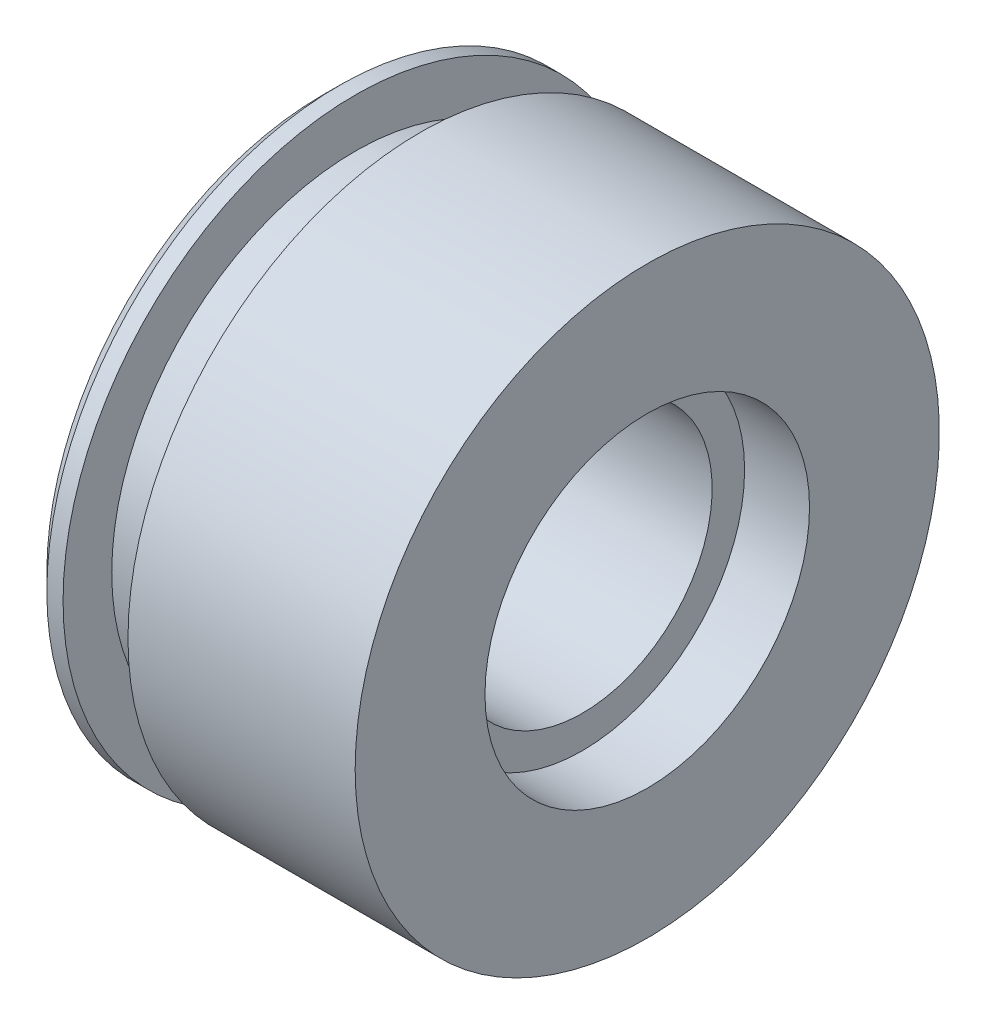
ISO-10303-21;
HEADER;
FILE_DESCRIPTION(('STEP AP214'),'2;1');
FILE_NAME('part.step','',(''),(''),'','','');
FILE_SCHEMA(('AUTOMOTIVE_DESIGN { 1 0 10303 214 1 1 1 1 }'));
ENDSEC;
DATA;
#1=APPLICATION_CONTEXT('core data for automotive mechanical design processes');
#2=APPLICATION_PROTOCOL_DEFINITION('international standard','automotive_design',2000,#1);
#3=PRODUCT_CONTEXT('',#1,'mechanical');
#4=PRODUCT('Part','Part','',(#3));
#5=PRODUCT_RELATED_PRODUCT_CATEGORY('part','',(#4));
#6=PRODUCT_DEFINITION_FORMATION('','',#4);
#7=PRODUCT_DEFINITION_CONTEXT('part definition',#1,'design');
#8=PRODUCT_DEFINITION('design','',#6,#7);
#9=PRODUCT_DEFINITION_SHAPE('','',#8);
#10=(LENGTH_UNIT() NAMED_UNIT(*) SI_UNIT(.MILLI.,.METRE.));
#11=(NAMED_UNIT(*) PLANE_ANGLE_UNIT() SI_UNIT($,.RADIAN.));
#12=(NAMED_UNIT(*) SI_UNIT($,.STERADIAN.) SOLID_ANGLE_UNIT());
#13=UNCERTAINTY_MEASURE_WITH_UNIT(LENGTH_MEASURE(1.E-05),#10,'distance_accuracy_value','');
#14=(GEOMETRIC_REPRESENTATION_CONTEXT(3) GLOBAL_UNCERTAINTY_ASSIGNED_CONTEXT((#13)) GLOBAL_UNIT_ASSIGNED_CONTEXT((#10,
#11,#12)) REPRESENTATION_CONTEXT('',''));
#15=CARTESIAN_POINT('',(0.,0.,0.));
#16=DIRECTION('',(0.,0.,1.));
#17=DIRECTION('',(1.,0.,0.));
#18=AXIS2_PLACEMENT_3D('',#15,#16,#17);
#19=CARTESIAN_POINT('',(8.,0.,-4.));
#20=DIRECTION('',(-1.,0.,0.));
#21=DIRECTION('',(0.,0.,1.));
#22=AXIS2_PLACEMENT_3D('',#19,#20,#21);
#23=PLANE('',#22);
#24=CARTESIAN_POINT('',(8.,0.,0.));
#25=DIRECTION('',(-1.,0.,0.));
#26=DIRECTION('',(0.,0.,1.));
#27=AXIS2_PLACEMENT_3D('',#24,#25,#26);
#28=CIRCLE('',#27,5.);
#29=CARTESIAN_POINT('',(8.,0.,5.));
#30=VERTEX_POINT('',#29);
#31=EDGE_CURVE('E67',#30,#30,#28,.T.);
#32=ORIENTED_EDGE('',*,*,#31,.F.);
#33=EDGE_LOOP('',(#32));
#34=FACE_BOUND('',#33,.T.);
#35=CARTESIAN_POINT('',(8.,0.,0.));
#36=DIRECTION('',(-1.,0.,0.));
#37=DIRECTION('',(0.,0.,1.));
#38=AXIS2_PLACEMENT_3D('',#35,#36,#37);
#39=CIRCLE('',#38,4.);
#40=CARTESIAN_POINT('',(8.,0.,4.));
#41=VERTEX_POINT('',#40);
#42=EDGE_CURVE('E10',#41,#41,#39,.T.);
#43=ORIENTED_EDGE('',*,*,#42,.T.);
#44=EDGE_LOOP('',(#43));
#45=FACE_BOUND('',#44,.T.);
#46=ADVANCED_FACE('F30',(#34,#45),#23,.F.);
#47=CARTESIAN_POINT('',(0.,0.,0.));
#48=DIRECTION('',(-1.,0.,0.));
#49=DIRECTION('',(0.,0.,1.));
#50=AXIS2_PLACEMENT_3D('',#47,#48,#49);
#51=CYLINDRICAL_SURFACE('',#50,4.);
#52=ORIENTED_EDGE('',*,*,#42,.F.);
#53=EDGE_LOOP('',(#52));
#54=FACE_BOUND('',#53,.T.);
#55=CARTESIAN_POINT('',(0.,0.,0.));
#56=DIRECTION('',(-1.,0.,0.));
#57=DIRECTION('',(0.,0.,1.));
#58=AXIS2_PLACEMENT_3D('',#55,#56,#57);
#59=CIRCLE('',#58,4.);
#60=CARTESIAN_POINT('',(0.,0.,4.));
#61=VERTEX_POINT('',#60);
#62=EDGE_CURVE('E36',#61,#61,#59,.T.);
#63=ORIENTED_EDGE('',*,*,#62,.T.);
#64=EDGE_LOOP('',(#63));
#65=FACE_BOUND('',#64,.T.);
#66=ADVANCED_FACE('F74',(#54,#65),#51,.F.);
#67=CARTESIAN_POINT('',(0.,0.,-8.5));
#68=DIRECTION('',(1.,0.,0.));
#69=DIRECTION('',(0.,0.,-1.));
#70=AXIS2_PLACEMENT_3D('',#67,#68,#69);
#71=PLANE('',#70);
#72=ORIENTED_EDGE('',*,*,#62,.F.);
#73=EDGE_LOOP('',(#72));
#74=FACE_BOUND('',#73,.T.);
#75=CARTESIAN_POINT('',(0.,0.,0.));
#76=DIRECTION('',(-1.,0.,0.));
#77=DIRECTION('',(0.,0.,1.));
#78=AXIS2_PLACEMENT_3D('',#75,#76,#77);
#79=CIRCLE('',#78,8.5);
#80=CARTESIAN_POINT('',(0.,0.,8.5));
#81=VERTEX_POINT('',#80);
#82=EDGE_CURVE('E40',#81,#81,#79,.T.);
#83=ORIENTED_EDGE('',*,*,#82,.T.);
#84=EDGE_LOOP('',(#83));
#85=FACE_BOUND('',#84,.T.);
#86=ADVANCED_FACE('F78',(#74,#85),#71,.F.);
#87=CARTESIAN_POINT('',(0.5,0.,0.));
#88=DIRECTION('',(1.,0.,0.));
#89=DIRECTION('',(0.,0.,-1.));
#90=AXIS2_PLACEMENT_3D('',#87,#88,#89);
#91=CONICAL_SURFACE('',#90,9.,0.785398163397447);
#92=ORIENTED_EDGE('',*,*,#82,.F.);
#93=EDGE_LOOP('',(#92));
#94=FACE_BOUND('',#93,.T.);
#95=CARTESIAN_POINT('',(0.5,0.,0.));
#96=DIRECTION('',(-1.,0.,0.));
#97=DIRECTION('',(0.,0.,1.));
#98=AXIS2_PLACEMENT_3D('',#95,#96,#97);
#99=CIRCLE('',#98,9.);
#100=CARTESIAN_POINT('',(0.5,0.,9.));
#101=VERTEX_POINT('',#100);
#102=EDGE_CURVE('E44',#101,#101,#99,.T.);
#103=ORIENTED_EDGE('',*,*,#102,.T.);
#104=EDGE_LOOP('',(#103));
#105=FACE_BOUND('',#104,.T.);
#106=ADVANCED_FACE('F83',(#94,#105),#91,.T.);
#107=CARTESIAN_POINT('',(0.,0.,0.));
#108=DIRECTION('',(-1.,0.,0.));
#109=DIRECTION('',(0.,0.,1.));
#110=AXIS2_PLACEMENT_3D('',#107,#108,#109);
#111=CYLINDRICAL_SURFACE('',#110,9.);
#112=ORIENTED_EDGE('',*,*,#102,.F.);
#113=EDGE_LOOP('',(#112));
#114=FACE_BOUND('',#113,.T.);
#115=CARTESIAN_POINT('',(1.,0.,0.));
#116=DIRECTION('',(-1.,0.,0.));
#117=DIRECTION('',(0.,0.,1.));
#118=AXIS2_PLACEMENT_3D('',#115,#116,#117);
#119=CIRCLE('',#118,9.);
#120=CARTESIAN_POINT('',(1.,0.,9.));
#121=VERTEX_POINT('',#120);
#122=EDGE_CURVE('E49',#121,#121,#119,.T.);
#123=ORIENTED_EDGE('',*,*,#122,.T.);
#124=EDGE_LOOP('',(#123));
#125=FACE_BOUND('',#124,.T.);
#126=ADVANCED_FACE('F89',(#114,#125),#111,.T.);
#127=CARTESIAN_POINT('',(1.,0.,-7.5));
#128=DIRECTION('',(-1.,0.,0.));
#129=DIRECTION('',(0.,0.,1.));
#130=AXIS2_PLACEMENT_3D('',#127,#128,#129);
#131=PLANE('',#130);
#132=ORIENTED_EDGE('',*,*,#122,.F.);
#133=EDGE_LOOP('',(#132));
#134=FACE_BOUND('',#133,.T.);
#135=CARTESIAN_POINT('',(1.,0.,0.));
#136=DIRECTION('',(-1.,0.,0.));
#137=DIRECTION('',(0.,0.,1.));
#138=AXIS2_PLACEMENT_3D('',#135,#136,#137);
#139=CIRCLE('',#138,7.5);
#140=CARTESIAN_POINT('',(1.,0.,7.5));
#141=VERTEX_POINT('',#140);
#142=EDGE_CURVE('E52',#141,#141,#139,.T.);
#143=ORIENTED_EDGE('',*,*,#142,.T.);
#144=EDGE_LOOP('',(#143));
#145=FACE_BOUND('',#144,.T.);
#146=ADVANCED_FACE('F93',(#134,#145),#131,.F.);
#147=CARTESIAN_POINT('',(0.,0.,0.));
#148=DIRECTION('',(-1.,0.,0.));
#149=DIRECTION('',(0.,0.,1.));
#150=AXIS2_PLACEMENT_3D('',#147,#148,#149);
#151=CYLINDRICAL_SURFACE('',#150,7.5);
#152=ORIENTED_EDGE('',*,*,#142,.F.);
#153=EDGE_LOOP('',(#152));
#154=FACE_BOUND('',#153,.T.);
#155=CARTESIAN_POINT('',(3.,0.,0.));
#156=DIRECTION('',(-1.,0.,0.));
#157=DIRECTION('',(0.,0.,1.));
#158=AXIS2_PLACEMENT_3D('',#155,#156,#157);
#159=CIRCLE('',#158,7.5);
#160=CARTESIAN_POINT('',(3.,0.,7.5));
#161=VERTEX_POINT('',#160);
#162=EDGE_CURVE('E55',#161,#161,#159,.T.);
#163=ORIENTED_EDGE('',*,*,#162,.T.);
#164=EDGE_LOOP('',(#163));
#165=FACE_BOUND('',#164,.T.);
#166=ADVANCED_FACE('F97',(#154,#165),#151,.T.);
#167=CARTESIAN_POINT('',(3.,0.,-9.));
#168=DIRECTION('',(1.,0.,0.));
#169=DIRECTION('',(0.,0.,-1.));
#170=AXIS2_PLACEMENT_3D('',#167,#168,#169);
#171=PLANE('',#170);
#172=ORIENTED_EDGE('',*,*,#162,.F.);
#173=EDGE_LOOP('',(#172));
#174=FACE_BOUND('',#173,.T.);
#175=CARTESIAN_POINT('',(3.,0.,0.));
#176=DIRECTION('',(-1.,0.,0.));
#177=DIRECTION('',(0.,0.,1.));
#178=AXIS2_PLACEMENT_3D('',#175,#176,#177);
#179=CIRCLE('',#178,9.);
#180=CARTESIAN_POINT('',(3.,0.,9.));
#181=VERTEX_POINT('',#180);
#182=EDGE_CURVE('E58',#181,#181,#179,.T.);
#183=ORIENTED_EDGE('',*,*,#182,.T.);
#184=EDGE_LOOP('',(#183));
#185=FACE_BOUND('',#184,.T.);
#186=ADVANCED_FACE('F101',(#174,#185),#171,.F.);
#187=CARTESIAN_POINT('',(0.,0.,0.));
#188=DIRECTION('',(-1.,0.,0.));
#189=DIRECTION('',(0.,0.,1.));
#190=AXIS2_PLACEMENT_3D('',#187,#188,#189);
#191=CYLINDRICAL_SURFACE('',#190,9.);
#192=ORIENTED_EDGE('',*,*,#182,.F.);
#193=EDGE_LOOP('',(#192));
#194=FACE_BOUND('',#193,.T.);
#195=CARTESIAN_POINT('',(10.,0.,0.));
#196=DIRECTION('',(-1.,0.,0.));
#197=DIRECTION('',(0.,0.,1.));
#198=AXIS2_PLACEMENT_3D('',#195,#196,#197);
#199=CIRCLE('',#198,9.);
#200=CARTESIAN_POINT('',(10.,0.,9.));
#201=VERTEX_POINT('',#200);
#202=EDGE_CURVE('E61',#201,#201,#199,.T.);
#203=ORIENTED_EDGE('',*,*,#202,.T.);
#204=EDGE_LOOP('',(#203));
#205=FACE_BOUND('',#204,.T.);
#206=ADVANCED_FACE('F105',(#194,#205),#191,.T.);
#207=CARTESIAN_POINT('',(10.,0.,-5.));
#208=DIRECTION('',(-1.,0.,0.));
#209=DIRECTION('',(0.,0.,1.));
#210=AXIS2_PLACEMENT_3D('',#207,#208,#209);
#211=PLANE('',#210);
#212=ORIENTED_EDGE('',*,*,#202,.F.);
#213=EDGE_LOOP('',(#212));
#214=FACE_BOUND('',#213,.T.);
#215=CARTESIAN_POINT('',(10.,0.,0.));
#216=DIRECTION('',(-1.,0.,0.));
#217=DIRECTION('',(0.,0.,1.));
#218=AXIS2_PLACEMENT_3D('',#215,#216,#217);
#219=CIRCLE('',#218,5.);
#220=CARTESIAN_POINT('',(10.,0.,5.));
#221=VERTEX_POINT('',#220);
#222=EDGE_CURVE('E64',#221,#221,#219,.T.);
#223=ORIENTED_EDGE('',*,*,#222,.T.);
#224=EDGE_LOOP('',(#223));
#225=FACE_BOUND('',#224,.T.);
#226=ADVANCED_FACE('F109',(#214,#225),#211,.F.);
#227=CARTESIAN_POINT('',(0.,0.,0.));
#228=DIRECTION('',(-1.,0.,0.));
#229=DIRECTION('',(0.,0.,1.));
#230=AXIS2_PLACEMENT_3D('',#227,#228,#229);
#231=CYLINDRICAL_SURFACE('',#230,5.);
#232=ORIENTED_EDGE('',*,*,#222,.F.);
#233=EDGE_LOOP('',(#232));
#234=FACE_BOUND('',#233,.T.);
#235=ORIENTED_EDGE('',*,*,#31,.T.);
#236=EDGE_LOOP('',(#235));
#237=FACE_BOUND('',#236,.T.);
#238=ADVANCED_FACE('F71',(#234,#237),#231,.F.);
#239=CLOSED_SHELL('',(#46,#66,#86,#106,#126,#146,#166,#186,#206,#226,#238));
#240=MANIFOLD_SOLID_BREP('B2',#239);
#241=ADVANCED_BREP_SHAPE_REPRESENTATION('',(#18,#240),#14);
#242=SHAPE_DEFINITION_REPRESENTATION(#9,#241);
ENDSEC;
END-ISO-10303-21;
